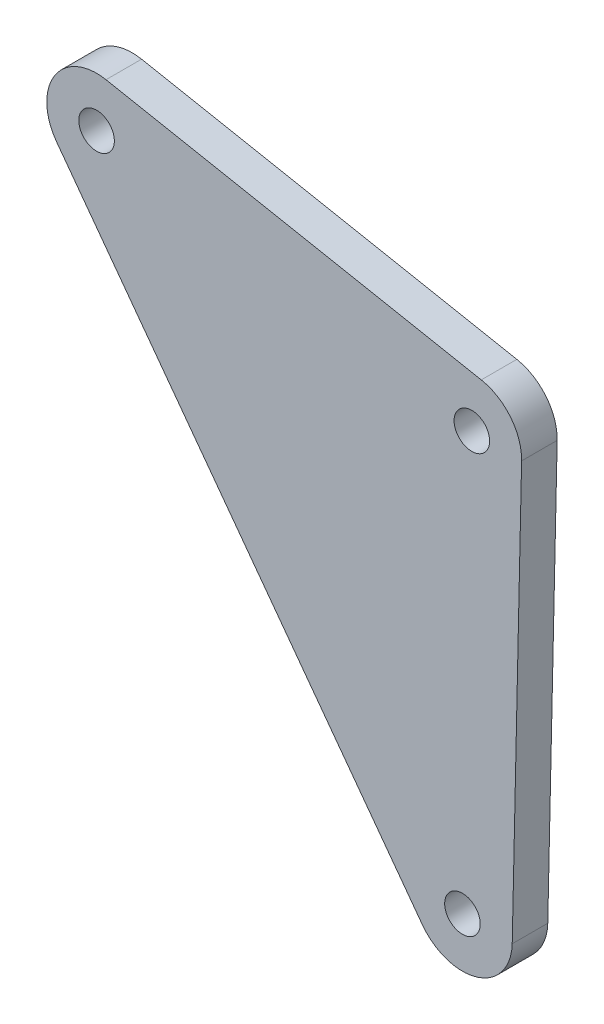
ISO-10303-21;
HEADER;
FILE_DESCRIPTION(('STEP AP214'),'2;1');
FILE_NAME('part.step','',(''),(''),'','','');
FILE_SCHEMA(('AUTOMOTIVE_DESIGN { 1 0 10303 214 1 1 1 1 }'));
ENDSEC;
DATA;
#1=APPLICATION_CONTEXT('core data for automotive mechanical design processes');
#2=APPLICATION_PROTOCOL_DEFINITION('international standard','automotive_design',2000,#1);
#3=PRODUCT_CONTEXT('',#1,'mechanical');
#4=PRODUCT('Part','Part','',(#3));
#5=PRODUCT_RELATED_PRODUCT_CATEGORY('part','',(#4));
#6=PRODUCT_DEFINITION_FORMATION('','',#4);
#7=PRODUCT_DEFINITION_CONTEXT('part definition',#1,'design');
#8=PRODUCT_DEFINITION('design','',#6,#7);
#9=PRODUCT_DEFINITION_SHAPE('','',#8);
#10=(LENGTH_UNIT() NAMED_UNIT(*) SI_UNIT(.MILLI.,.METRE.));
#11=(NAMED_UNIT(*) PLANE_ANGLE_UNIT() SI_UNIT($,.RADIAN.));
#12=(NAMED_UNIT(*) SI_UNIT($,.STERADIAN.) SOLID_ANGLE_UNIT());
#13=UNCERTAINTY_MEASURE_WITH_UNIT(LENGTH_MEASURE(1.E-05),#10,'distance_accuracy_value','');
#14=(GEOMETRIC_REPRESENTATION_CONTEXT(3) GLOBAL_UNCERTAINTY_ASSIGNED_CONTEXT((#13)) GLOBAL_UNIT_ASSIGNED_CONTEXT((#10,
#11,#12)) REPRESENTATION_CONTEXT('',''));
#15=CARTESIAN_POINT('',(0.,0.,0.));
#16=DIRECTION('',(0.,0.,1.));
#17=DIRECTION('',(1.,0.,0.));
#18=AXIS2_PLACEMENT_3D('',#15,#16,#17);
#19=CARTESIAN_POINT('',(0.,0.,6.35));
#20=DIRECTION('',(0.,0.,-1.));
#21=DIRECTION('',(-1.,0.,0.));
#22=AXIS2_PLACEMENT_3D('',#19,#20,#21);
#23=PLANE('',#22);
#24=DIRECTION('',(0.594213554167405,-0.804307311942233,0.));
#25=VECTOR('',#24,1.);
#26=CARTESIAN_POINT('',(46.3443958693642,-119.203213440835,6.35));
#27=LINE('',#26,#25);
#28=CARTESIAN_POINT('',(-34.4533134300977,-9.83817469008332,6.35));
#29=VERTEX_POINT('',#28);
#30=CARTESIAN_POINT('',(30.884388660066,-98.2770720663907,6.35));
#31=VERTEX_POINT('',#30);
#32=EDGE_CURVE('E135',#29,#31,#27,.T.);
#33=ORIENTED_EDGE('',*,*,#32,.T.);
#34=CARTESIAN_POINT('',(38.0346806632325,-92.9945135698425,6.35));
#35=DIRECTION('',(0.,0.,-1.));
#36=DIRECTION('',(-1.,0.,0.));
#37=AXIS2_PLACEMENT_3D('',#34,#35,#36);
#38=CIRCLE('',#37,8.89);
#39=CARTESIAN_POINT('',(46.9224859281642,-93.1920422327041,6.35));
#40=VERTEX_POINT('',#39);
#41=EDGE_CURVE('E156',#31,#40,#38,.F.);
#42=ORIENTED_EDGE('',*,*,#41,.T.);
#43=DIRECTION('',(0.0222191971722874,0.999753123164423,0.));
#44=VECTOR('',#43,1.);
#45=CARTESIAN_POINT('',(48.7677297439097,-10.1652679758774,6.35));
#46=LINE('',#45,#44);
#47=CARTESIAN_POINT('',(48.6009151948799,-17.6710912101128,6.35));
#48=VERTEX_POINT('',#47);
#49=EDGE_CURVE('E118',#40,#48,#46,.T.);
#50=ORIENTED_EDGE('',*,*,#49,.T.);
#51=CARTESIAN_POINT('',(39.7131099299482,-17.4735625472512,6.35));
#52=DIRECTION('',(0.,0.,-1.));
#53=DIRECTION('',(-1.,0.,0.));
#54=AXIS2_PLACEMENT_3D('',#51,#52,#53);
#55=CIRCLE('',#54,8.89);
#56=CARTESIAN_POINT('',(41.3957601807113,-8.74425626704728,6.35));
#57=VERTEX_POINT('',#56);
#58=EDGE_CURVE('E69',#48,#57,#55,.F.);
#59=ORIENTED_EDGE('',*,*,#58,.T.);
#60=DIRECTION('',(-0.981924215995935,0.189274493899118,0.));
#61=VECTOR('',#60,1.);
#62=CARTESIAN_POINT('',(-47.990867403231,8.48579919109173,6.35));
#63=LINE('',#62,#61);
#64=CARTESIAN_POINT('',(-25.6203711761681,4.17369008666876,6.35));
#65=VERTEX_POINT('',#64);
#66=EDGE_CURVE('E137',#57,#65,#63,.T.);
#67=ORIENTED_EDGE('',*,*,#66,.T.);
#68=CARTESIAN_POINT('',(-27.3030214269312,-4.55561619353509,6.35));
#69=DIRECTION('',(0.,0.,-1.));
#70=DIRECTION('',(-1.,0.,0.));
#71=AXIS2_PLACEMENT_3D('',#68,#69,#70);
#72=CIRCLE('',#71,8.89);
#73=EDGE_CURVE('E153',#65,#29,#72,.F.);
#74=ORIENTED_EDGE('',*,*,#73,.T.);
#75=EDGE_LOOP('',(#33,#42,#50,#59,#67,#74));
#76=FACE_BOUND('',#75,.T.);
#77=CARTESIAN_POINT('',(-27.3030214269312,-4.55561619353511,6.35));
#78=DIRECTION('',(0.,0.,1.));
#79=DIRECTION('',(1.,0.,0.));
#80=AXIS2_PLACEMENT_3D('',#77,#78,#79);
#81=CIRCLE('',#80,3.175);
#82=CARTESIAN_POINT('',(-24.1280214269312,-4.55561619353511,6.35));
#83=VERTEX_POINT('',#82);
#84=EDGE_CURVE('E132',#83,#83,#81,.T.);
#85=ORIENTED_EDGE('',*,*,#84,.F.);
#86=EDGE_LOOP('',(#85));
#87=FACE_BOUND('',#86,.T.);
#88=CARTESIAN_POINT('',(39.7131099299482,-17.4735625472511,6.35));
#89=DIRECTION('',(0.,0.,1.));
#90=DIRECTION('',(1.,0.,0.));
#91=AXIS2_PLACEMENT_3D('',#88,#89,#90);
#92=CIRCLE('',#91,3.175);
#93=CARTESIAN_POINT('',(42.8881099299482,-17.4735625472511,6.35));
#94=VERTEX_POINT('',#93);
#95=EDGE_CURVE('E190',#94,#94,#92,.T.);
#96=ORIENTED_EDGE('',*,*,#95,.F.);
#97=EDGE_LOOP('',(#96));
#98=FACE_BOUND('',#97,.T.);
#99=CARTESIAN_POINT('',(38.0346806632324,-92.9945135698424,6.35));
#100=DIRECTION('',(0.,0.,1.));
#101=DIRECTION('',(1.,0.,0.));
#102=AXIS2_PLACEMENT_3D('',#99,#100,#101);
#103=CIRCLE('',#102,3.175);
#104=CARTESIAN_POINT('',(41.2096806632324,-92.9945135698424,6.35));
#105=VERTEX_POINT('',#104);
#106=EDGE_CURVE('E194',#105,#105,#103,.T.);
#107=ORIENTED_EDGE('',*,*,#106,.F.);
#108=EDGE_LOOP('',(#107));
#109=FACE_BOUND('',#108,.T.);
#110=ADVANCED_FACE('F44',(#76,#87,#98,#109),#23,.F.);
#111=CARTESIAN_POINT('',(0.,0.,0.));
#112=DIRECTION('',(0.,0.,-1.));
#113=DIRECTION('',(-1.,0.,0.));
#114=AXIS2_PLACEMENT_3D('',#111,#112,#113);
#115=PLANE('',#114);
#116=CARTESIAN_POINT('',(39.7131099299482,-17.4735625472511,0.));
#117=DIRECTION('',(0.,0.,1.));
#118=DIRECTION('',(1.,0.,0.));
#119=AXIS2_PLACEMENT_3D('',#116,#117,#118);
#120=CIRCLE('',#119,3.175);
#121=CARTESIAN_POINT('',(42.8881099299482,-17.4735625472511,0.));
#122=VERTEX_POINT('',#121);
#123=EDGE_CURVE('E193',#122,#122,#120,.T.);
#124=ORIENTED_EDGE('',*,*,#123,.T.);
#125=EDGE_LOOP('',(#124));
#126=FACE_BOUND('',#125,.T.);
#127=DIRECTION('',(0.0222191971722874,0.999753123164423,0.));
#128=VECTOR('',#127,1.);
#129=CARTESIAN_POINT('',(48.7677297439097,-10.1652679758774,0.));
#130=LINE('',#129,#128);
#131=CARTESIAN_POINT('',(46.9224859281642,-93.1920422327041,0.));
#132=VERTEX_POINT('',#131);
#133=CARTESIAN_POINT('',(48.6009151948799,-17.6710912101128,0.));
#134=VERTEX_POINT('',#133);
#135=EDGE_CURVE('E116',#132,#134,#130,.T.);
#136=ORIENTED_EDGE('',*,*,#135,.F.);
#137=CARTESIAN_POINT('',(38.0346806632325,-92.9945135698425,0.));
#138=DIRECTION('',(0.,0.,-1.));
#139=DIRECTION('',(-1.,0.,0.));
#140=AXIS2_PLACEMENT_3D('',#137,#138,#139);
#141=CIRCLE('',#140,8.89);
#142=CARTESIAN_POINT('',(30.884388660066,-98.2770720663907,0.));
#143=VERTEX_POINT('',#142);
#144=EDGE_CURVE('E97',#132,#143,#141,.T.);
#145=ORIENTED_EDGE('',*,*,#144,.T.);
#146=DIRECTION('',(0.594213554167405,-0.804307311942233,0.));
#147=VECTOR('',#146,1.);
#148=CARTESIAN_POINT('',(46.3443958693642,-119.203213440835,0.));
#149=LINE('',#148,#147);
#150=CARTESIAN_POINT('',(-34.4533134300977,-9.83817469008332,0.));
#151=VERTEX_POINT('',#150);
#152=EDGE_CURVE('E129',#151,#143,#149,.T.);
#153=ORIENTED_EDGE('',*,*,#152,.F.);
#154=CARTESIAN_POINT('',(-27.3030214269312,-4.55561619353509,0.));
#155=DIRECTION('',(0.,0.,-1.));
#156=DIRECTION('',(-1.,0.,0.));
#157=AXIS2_PLACEMENT_3D('',#154,#155,#156);
#158=CIRCLE('',#157,8.89);
#159=CARTESIAN_POINT('',(-25.6203711761681,4.17369008666876,0.));
#160=VERTEX_POINT('',#159);
#161=EDGE_CURVE('E112',#151,#160,#158,.T.);
#162=ORIENTED_EDGE('',*,*,#161,.T.);
#163=DIRECTION('',(-0.981924215995935,0.189274493899118,0.));
#164=VECTOR('',#163,1.);
#165=CARTESIAN_POINT('',(-47.990867403231,8.48579919109173,0.));
#166=LINE('',#165,#164);
#167=CARTESIAN_POINT('',(41.3957601807113,-8.74425626704728,0.));
#168=VERTEX_POINT('',#167);
#169=EDGE_CURVE('E126',#168,#160,#166,.T.);
#170=ORIENTED_EDGE('',*,*,#169,.F.);
#171=CARTESIAN_POINT('',(39.7131099299482,-17.4735625472512,0.));
#172=DIRECTION('',(0.,0.,-1.));
#173=DIRECTION('',(-1.,0.,0.));
#174=AXIS2_PLACEMENT_3D('',#171,#172,#173);
#175=CIRCLE('',#174,8.89);
#176=EDGE_CURVE('E124',#168,#134,#175,.T.);
#177=ORIENTED_EDGE('',*,*,#176,.T.);
#178=EDGE_LOOP('',(#136,#145,#153,#162,#170,#177));
#179=FACE_BOUND('',#178,.T.);
#180=CARTESIAN_POINT('',(-27.3030214269312,-4.55561619353511,0.));
#181=DIRECTION('',(0.,0.,1.));
#182=DIRECTION('',(1.,0.,0.));
#183=AXIS2_PLACEMENT_3D('',#180,#181,#182);
#184=CIRCLE('',#183,3.175);
#185=CARTESIAN_POINT('',(-24.1280214269312,-4.55561619353511,0.));
#186=VERTEX_POINT('',#185);
#187=EDGE_CURVE('E179',#186,#186,#184,.T.);
#188=ORIENTED_EDGE('',*,*,#187,.T.);
#189=EDGE_LOOP('',(#188));
#190=FACE_BOUND('',#189,.T.);
#191=CARTESIAN_POINT('',(38.0346806632324,-92.9945135698424,0.));
#192=DIRECTION('',(0.,0.,1.));
#193=DIRECTION('',(1.,0.,0.));
#194=AXIS2_PLACEMENT_3D('',#191,#192,#193);
#195=CIRCLE('',#194,3.175);
#196=CARTESIAN_POINT('',(41.2096806632324,-92.9945135698424,0.));
#197=VERTEX_POINT('',#196);
#198=EDGE_CURVE('E192',#197,#197,#195,.T.);
#199=ORIENTED_EDGE('',*,*,#198,.T.);
#200=EDGE_LOOP('',(#199));
#201=FACE_BOUND('',#200,.T.);
#202=ADVANCED_FACE('F123',(#126,#179,#190,#201),#115,.T.);
#203=CARTESIAN_POINT('',(46.3443958693642,-119.203213440835,6.35));
#204=DIRECTION('',(0.804307311942233,0.594213554167405,0.));
#205=DIRECTION('',(-0.594213554167405,0.804307311942233,0.));
#206=AXIS2_PLACEMENT_3D('',#203,#204,#205);
#207=PLANE('',#206);
#208=ORIENTED_EDGE('',*,*,#152,.T.);
#209=DIRECTION('',(0.,0.,-1.));
#210=VECTOR('',#209,1.);
#211=CARTESIAN_POINT('',(30.884388660066,-98.2770720663907,6.35));
#212=LINE('',#211,#210);
#213=EDGE_CURVE('E102',#143,#31,#212,.F.);
#214=ORIENTED_EDGE('',*,*,#213,.T.);
#215=ORIENTED_EDGE('',*,*,#32,.F.);
#216=DIRECTION('',(0.,0.,-1.));
#217=VECTOR('',#216,1.);
#218=CARTESIAN_POINT('',(-34.4533134300977,-9.8381746900833,6.35));
#219=LINE('',#218,#217);
#220=EDGE_CURVE('E109',#29,#151,#219,.T.);
#221=ORIENTED_EDGE('',*,*,#220,.T.);
#222=EDGE_LOOP('',(#208,#214,#215,#221));
#223=FACE_BOUND('',#222,.T.);
#224=ADVANCED_FACE('F166',(#223),#207,.F.);
#225=CARTESIAN_POINT('',(48.7677297439097,-10.1652679758774,6.35));
#226=DIRECTION('',(-0.999753123164424,0.0222191971722874,0.));
#227=DIRECTION('',(-0.0222191971722874,-0.999753123164424,0.));
#228=AXIS2_PLACEMENT_3D('',#225,#226,#227);
#229=PLANE('',#228);
#230=ORIENTED_EDGE('',*,*,#49,.F.);
#231=DIRECTION('',(0.,0.,-1.));
#232=VECTOR('',#231,1.);
#233=CARTESIAN_POINT('',(46.9224859281642,-93.1920422327041,6.35));
#234=LINE('',#233,#232);
#235=EDGE_CURVE('E103',#40,#132,#234,.T.);
#236=ORIENTED_EDGE('',*,*,#235,.T.);
#237=ORIENTED_EDGE('',*,*,#135,.T.);
#238=DIRECTION('',(0.,0.,-1.));
#239=VECTOR('',#238,1.);
#240=CARTESIAN_POINT('',(48.6009151948799,-17.6710912101128,6.35));
#241=LINE('',#240,#239);
#242=EDGE_CURVE('E121',#134,#48,#241,.F.);
#243=ORIENTED_EDGE('',*,*,#242,.T.);
#244=EDGE_LOOP('',(#230,#236,#237,#243));
#245=FACE_BOUND('',#244,.T.);
#246=ADVANCED_FACE('F119',(#245),#229,.F.);
#247=CARTESIAN_POINT('',(-47.990867403231,8.48579919109173,6.35));
#248=DIRECTION('',(-0.189274493899118,-0.981924215995936,0.));
#249=DIRECTION('',(0.981924215995936,-0.189274493899118,0.));
#250=AXIS2_PLACEMENT_3D('',#247,#248,#249);
#251=PLANE('',#250);
#252=ORIENTED_EDGE('',*,*,#169,.T.);
#253=DIRECTION('',(0.,0.,-1.));
#254=VECTOR('',#253,1.);
#255=CARTESIAN_POINT('',(-25.6203711761681,4.17369008666876,6.35));
#256=LINE('',#255,#254);
#257=EDGE_CURVE('E11',#160,#65,#256,.F.);
#258=ORIENTED_EDGE('',*,*,#257,.T.);
#259=ORIENTED_EDGE('',*,*,#66,.F.);
#260=DIRECTION('',(0.,0.,-1.));
#261=VECTOR('',#260,1.);
#262=CARTESIAN_POINT('',(41.3957601807113,-8.74425626704728,6.35));
#263=LINE('',#262,#261);
#264=EDGE_CURVE('E53',#57,#168,#263,.T.);
#265=ORIENTED_EDGE('',*,*,#264,.T.);
#266=EDGE_LOOP('',(#252,#258,#259,#265));
#267=FACE_BOUND('',#266,.T.);
#268=ADVANCED_FACE('F161',(#267),#251,.F.);
#269=CARTESIAN_POINT('',(-27.3030214269312,-4.55561619353511,6.35));
#270=DIRECTION('',(0.,0.,-1.));
#271=DIRECTION('',(-1.,0.,0.));
#272=AXIS2_PLACEMENT_3D('',#269,#270,#271);
#273=CYLINDRICAL_SURFACE('',#272,3.175);
#274=ORIENTED_EDGE('',*,*,#84,.T.);
#275=EDGE_LOOP('',(#274));
#276=FACE_BOUND('',#275,.T.);
#277=ORIENTED_EDGE('',*,*,#187,.F.);
#278=EDGE_LOOP('',(#277));
#279=FACE_BOUND('',#278,.T.);
#280=ADVANCED_FACE('F215',(#276,#279),#273,.F.);
#281=CARTESIAN_POINT('',(39.7131099299482,-17.4735625472511,6.35));
#282=DIRECTION('',(0.,0.,-1.));
#283=DIRECTION('',(-1.,0.,0.));
#284=AXIS2_PLACEMENT_3D('',#281,#282,#283);
#285=CYLINDRICAL_SURFACE('',#284,3.175);
#286=ORIENTED_EDGE('',*,*,#95,.T.);
#287=EDGE_LOOP('',(#286));
#288=FACE_BOUND('',#287,.T.);
#289=ORIENTED_EDGE('',*,*,#123,.F.);
#290=EDGE_LOOP('',(#289));
#291=FACE_BOUND('',#290,.T.);
#292=ADVANCED_FACE('F212',(#288,#291),#285,.F.);
#293=CARTESIAN_POINT('',(38.0346806632324,-92.9945135698424,6.35));
#294=DIRECTION('',(0.,0.,-1.));
#295=DIRECTION('',(-1.,0.,0.));
#296=AXIS2_PLACEMENT_3D('',#293,#294,#295);
#297=CYLINDRICAL_SURFACE('',#296,3.175);
#298=ORIENTED_EDGE('',*,*,#106,.T.);
#299=EDGE_LOOP('',(#298));
#300=FACE_BOUND('',#299,.T.);
#301=ORIENTED_EDGE('',*,*,#198,.F.);
#302=EDGE_LOOP('',(#301));
#303=FACE_BOUND('',#302,.T.);
#304=ADVANCED_FACE('F218',(#300,#303),#297,.F.);
#305=CARTESIAN_POINT('',(38.0346806632325,-92.9945135698425,6.35));
#306=DIRECTION('',(0.,0.,-1.));
#307=DIRECTION('',(-1.,0.,0.));
#308=AXIS2_PLACEMENT_3D('',#305,#306,#307);
#309=CYLINDRICAL_SURFACE('',#308,8.89);
#310=ORIENTED_EDGE('',*,*,#41,.F.);
#311=ORIENTED_EDGE('',*,*,#213,.F.);
#312=ORIENTED_EDGE('',*,*,#144,.F.);
#313=ORIENTED_EDGE('',*,*,#235,.F.);
#314=EDGE_LOOP('',(#310,#311,#312,#313));
#315=FACE_BOUND('',#314,.T.);
#316=ADVANCED_FACE('F105',(#315),#309,.T.);
#317=CARTESIAN_POINT('',(-27.3030214269312,-4.55561619353509,6.35));
#318=DIRECTION('',(0.,0.,-1.));
#319=DIRECTION('',(-1.,0.,0.));
#320=AXIS2_PLACEMENT_3D('',#317,#318,#319);
#321=CYLINDRICAL_SURFACE('',#320,8.89);
#322=ORIENTED_EDGE('',*,*,#73,.F.);
#323=ORIENTED_EDGE('',*,*,#257,.F.);
#324=ORIENTED_EDGE('',*,*,#161,.F.);
#325=ORIENTED_EDGE('',*,*,#220,.F.);
#326=EDGE_LOOP('',(#322,#323,#324,#325));
#327=FACE_BOUND('',#326,.T.);
#328=ADVANCED_FACE('F167',(#327),#321,.T.);
#329=CARTESIAN_POINT('',(39.7131099299482,-17.4735625472512,6.35));
#330=DIRECTION('',(0.,0.,-1.));
#331=DIRECTION('',(-1.,0.,0.));
#332=AXIS2_PLACEMENT_3D('',#329,#330,#331);
#333=CYLINDRICAL_SURFACE('',#332,8.89);
#334=ORIENTED_EDGE('',*,*,#58,.F.);
#335=ORIENTED_EDGE('',*,*,#242,.F.);
#336=ORIENTED_EDGE('',*,*,#176,.F.);
#337=ORIENTED_EDGE('',*,*,#264,.F.);
#338=EDGE_LOOP('',(#334,#335,#336,#337));
#339=FACE_BOUND('',#338,.T.);
#340=ADVANCED_FACE('F50',(#339),#333,.T.);
#341=CLOSED_SHELL('',(#110,#202,#224,#246,#268,#280,#292,#304,#316,#328,#340));
#342=MANIFOLD_SOLID_BREP('B2',#341);
#343=ADVANCED_BREP_SHAPE_REPRESENTATION('',(#18,#342),#14);
#344=SHAPE_DEFINITION_REPRESENTATION(#9,#343);
ENDSEC;
END-ISO-10303-21;
